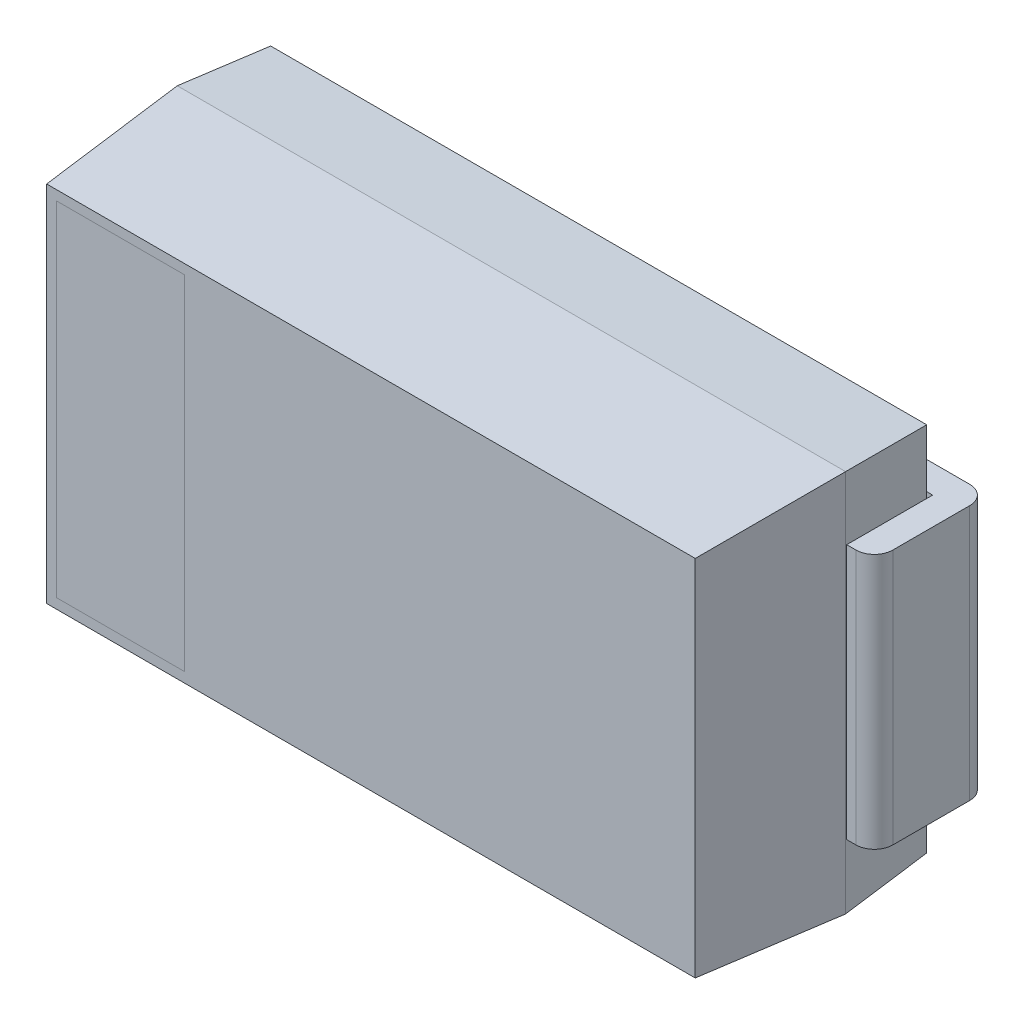
ISO-10303-21;
HEADER;
FILE_DESCRIPTION(('STEP AP214'),'2;1');
FILE_NAME('part.step','',(''),(''),'','','');
FILE_SCHEMA(('AUTOMOTIVE_DESIGN { 1 0 10303 214 1 1 1 1 }'));
ENDSEC;
DATA;
#1=APPLICATION_CONTEXT('core data for automotive mechanical design processes');
#2=APPLICATION_PROTOCOL_DEFINITION('international standard','automotive_design',2000,#1);
#3=PRODUCT_CONTEXT('',#1,'mechanical');
#4=PRODUCT('Part','Part','',(#3));
#5=PRODUCT_RELATED_PRODUCT_CATEGORY('part','',(#4));
#6=PRODUCT_DEFINITION_FORMATION('','',#4);
#7=PRODUCT_DEFINITION_CONTEXT('part definition',#1,'design');
#8=PRODUCT_DEFINITION('design','',#6,#7);
#9=PRODUCT_DEFINITION_SHAPE('','',#8);
#10=(LENGTH_UNIT() NAMED_UNIT(*) SI_UNIT(.MILLI.,.METRE.));
#11=(NAMED_UNIT(*) PLANE_ANGLE_UNIT() SI_UNIT($,.RADIAN.));
#12=(NAMED_UNIT(*) SI_UNIT($,.STERADIAN.) SOLID_ANGLE_UNIT());
#13=UNCERTAINTY_MEASURE_WITH_UNIT(LENGTH_MEASURE(1.E-05),#10,'distance_accuracy_value','');
#14=(GEOMETRIC_REPRESENTATION_CONTEXT(3) GLOBAL_UNCERTAINTY_ASSIGNED_CONTEXT((#13)) GLOBAL_UNIT_ASSIGNED_CONTEXT((#10,
#11,#12)) REPRESENTATION_CONTEXT('',''));
#15=CARTESIAN_POINT('',(0.,0.,0.));
#16=DIRECTION('',(0.,0.,1.));
#17=DIRECTION('',(1.,0.,0.));
#18=AXIS2_PLACEMENT_3D('',#15,#16,#17);
#19=CARTESIAN_POINT('',(1.57070097561994,-0.91,0.549975401404468));
#20=DIRECTION('',(0.997540140446752,0.,-0.0700975619937967));
#21=DIRECTION('',(-0.0700975619937967,0.,-0.997540140446752));
#22=AXIS2_PLACEMENT_3D('',#19,#20,#21);
#23=PLANE('',#22);
#24=CARTESIAN_POINT('',(1.541189128886,0.871189128886001,0.13));
#25=DIRECTION('',(0.0699259759924694,0.0699259759924605,0.995098344769502));
#26=VECTOR('',#25,1.);
#27=LINE('',#24,#26);
#28=CARTESIAN_POINT('',(1.541189128886,0.871189128886,0.13));
#29=VERTEX_POINT('',#28);
#30=CARTESIAN_POINT('',(1.57,0.9,0.54));
#31=VERTEX_POINT('',#30);
#32=EDGE_CURVE('E299',#29,#31,#27,.T.);
#33=ORIENTED_EDGE('',*,*,#32,.T.);
#34=DIRECTION('',(0.,1.,0.));
#35=VECTOR('',#34,1.);
#36=CARTESIAN_POINT('',(1.57,0.,0.54));
#37=LINE('',#36,#35);
#38=CARTESIAN_POINT('',(1.57,-0.9,0.54));
#39=VERTEX_POINT('',#38);
#40=EDGE_CURVE('E327',#39,#31,#37,.T.);
#41=ORIENTED_EDGE('',*,*,#40,.F.);
#42=CARTESIAN_POINT('',(1.57,-0.9,0.54));
#43=DIRECTION('',(-0.0699259759924694,0.0699259759924607,-0.995098344769502));
#44=VECTOR('',#43,1.);
#45=LINE('',#42,#44);
#46=CARTESIAN_POINT('',(1.541189128886,-0.871189128886,0.13));
#47=VERTEX_POINT('',#46);
#48=EDGE_CURVE('E310',#39,#47,#45,.T.);
#49=ORIENTED_EDGE('',*,*,#48,.T.);
#50=DIRECTION('',(0.,1.,0.));
#51=VECTOR('',#50,1.);
#52=CARTESIAN_POINT('',(1.541189128886,0.,0.13));
#53=LINE('',#52,#51);
#54=CARTESIAN_POINT('',(1.54123480465739,-0.6,0.130650000000008));
#55=VERTEX_POINT('',#54);
#56=EDGE_CURVE('E305',#47,#55,#53,.T.);
#57=ORIENTED_EDGE('',*,*,#56,.T.);
#58=DIRECTION('',(0.,1.,0.));
#59=VECTOR('',#58,1.);
#60=CARTESIAN_POINT('',(1.54128048042856,0.,0.131300000000031));
#61=LINE('',#60,#59);
#62=CARTESIAN_POINT('',(1.54123480465739,0.6,0.130650000000008));
#63=VERTEX_POINT('',#62);
#64=EDGE_CURVE('E300',#55,#63,#61,.T.);
#65=ORIENTED_EDGE('',*,*,#64,.T.);
#66=DIRECTION('',(0.,1.,0.));
#67=VECTOR('',#66,1.);
#68=CARTESIAN_POINT('',(1.541189128886,0.,0.13));
#69=LINE('',#68,#67);
#70=EDGE_CURVE('E296',#63,#29,#69,.T.);
#71=ORIENTED_EDGE('',*,*,#70,.T.);
#72=EDGE_LOOP('',(#33,#41,#49,#57,#65,#71));
#73=FACE_BOUND('',#72,.T.);
#74=ADVANCED_FACE('F17',(#73),#23,.T.);
#75=CARTESIAN_POINT('',(-1.54048815326606,-0.91,0.120024598595532));
#76=DIRECTION('',(-0.997540140446752,0.,-0.0700975619937967));
#77=DIRECTION('',(-0.0700975619937967,0.,0.997540140446752));
#78=AXIS2_PLACEMENT_3D('',#75,#76,#77);
#79=PLANE('',#78);
#80=CARTESIAN_POINT('',(-1.541189128886,-0.871189128886,0.13));
#81=DIRECTION('',(-0.0699259759924694,-0.0699259759924607,0.995098344769502));
#82=VECTOR('',#81,1.);
#83=LINE('',#80,#82);
#84=CARTESIAN_POINT('',(-1.541189128886,-0.871189128886,0.13));
#85=VERTEX_POINT('',#84);
#86=CARTESIAN_POINT('',(-1.57,-0.9,0.54));
#87=VERTEX_POINT('',#86);
#88=EDGE_CURVE('E282',#85,#87,#83,.T.);
#89=ORIENTED_EDGE('',*,*,#88,.T.);
#90=DIRECTION('',(0.,-1.,0.));
#91=VECTOR('',#90,1.);
#92=CARTESIAN_POINT('',(-1.57,0.,0.54));
#93=LINE('',#92,#91);
#94=CARTESIAN_POINT('',(-1.57,0.9,0.54));
#95=VERTEX_POINT('',#94);
#96=EDGE_CURVE('E313',#95,#87,#93,.T.);
#97=ORIENTED_EDGE('',*,*,#96,.F.);
#98=CARTESIAN_POINT('',(-1.57,0.900000000000001,0.54));
#99=DIRECTION('',(0.0699259759924694,-0.0699259759924605,-0.995098344769502));
#100=VECTOR('',#99,1.);
#101=LINE('',#98,#100);
#102=CARTESIAN_POINT('',(-1.541189128886,0.871189128885999,0.13));
#103=VERTEX_POINT('',#102);
#104=EDGE_CURVE('E293',#95,#103,#101,.T.);
#105=ORIENTED_EDGE('',*,*,#104,.T.);
#106=DIRECTION('',(0.,-1.,0.));
#107=VECTOR('',#106,1.);
#108=CARTESIAN_POINT('',(-1.541189128886,0.,0.13));
#109=LINE('',#108,#107);
#110=CARTESIAN_POINT('',(-1.54123480465739,0.6,0.130650000000008));
#111=VERTEX_POINT('',#110);
#112=EDGE_CURVE('E288',#103,#111,#109,.T.);
#113=ORIENTED_EDGE('',*,*,#112,.T.);
#114=DIRECTION('',(0.,-1.,0.));
#115=VECTOR('',#114,1.);
#116=CARTESIAN_POINT('',(-1.54128048042856,0.,0.131300000000031));
#117=LINE('',#116,#115);
#118=CARTESIAN_POINT('',(-1.54123480465739,-0.6,0.130650000000008));
#119=VERTEX_POINT('',#118);
#120=EDGE_CURVE('E283',#111,#119,#117,.T.);
#121=ORIENTED_EDGE('',*,*,#120,.T.);
#122=DIRECTION('',(0.,-1.,0.));
#123=VECTOR('',#122,1.);
#124=CARTESIAN_POINT('',(-1.541189128886,0.,0.13));
#125=LINE('',#124,#123);
#126=EDGE_CURVE('E279',#119,#85,#125,.T.);
#127=ORIENTED_EDGE('',*,*,#126,.T.);
#128=EDGE_LOOP('',(#89,#97,#105,#113,#121,#127));
#129=FACE_BOUND('',#128,.T.);
#130=ADVANCED_FACE('F353',(#129),#79,.T.);
#131=CARTESIAN_POINT('',(1.52292054892806,-0.91,1.20997540140447));
#132=DIRECTION('',(0.997540140446732,0.,0.0700975619940784));
#133=DIRECTION('',(0.0700975619940784,0.,-0.997540140446732));
#134=AXIS2_PLACEMENT_3D('',#131,#132,#133);
#135=PLANE('',#134);
#136=CARTESIAN_POINT('',(1.523621524548,-0.853621524548,1.2));
#137=DIRECTION('',(0.,1.,0.));
#138=VECTOR('',#137,1.);
#139=LINE('',#136,#138);
#140=CARTESIAN_POINT('',(1.523621524548,-0.853621524423,1.2));
#141=VERTEX_POINT('',#140);
#142=CARTESIAN_POINT('',(1.523621524548,0.853621524423,1.2));
#143=VERTEX_POINT('',#142);
#144=EDGE_CURVE('E559',#141,#143,#139,.T.);
#145=ORIENTED_EDGE('',*,*,#144,.F.);
#146=CARTESIAN_POINT('',(1.523621524548,-0.853621524548,1.2));
#147=DIRECTION('',(0.0699259759927496,-0.0699259759927517,-0.995098344769462));
#148=VECTOR('',#147,1.);
#149=LINE('',#146,#148);
#150=EDGE_CURVE('E317',#141,#39,#149,.T.);
#151=ORIENTED_EDGE('',*,*,#150,.T.);
#152=ORIENTED_EDGE('',*,*,#40,.T.);
#153=CARTESIAN_POINT('',(1.57,0.900000000000001,0.54));
#154=DIRECTION('',(-0.0699259759927496,-0.0699259759927513,0.995098344769462));
#155=VECTOR('',#154,1.);
#156=LINE('',#153,#155);
#157=EDGE_CURVE('E330',#31,#143,#156,.T.);
#158=ORIENTED_EDGE('',*,*,#157,.T.);
#159=EDGE_LOOP('',(#145,#151,#152,#158));
#160=FACE_BOUND('',#159,.T.);
#161=ADVANCED_FACE('F395',(#160),#135,.T.);
#162=CARTESIAN_POINT('',(-1.57070097561994,-0.91,0.530024598595533));
#163=DIRECTION('',(-0.997540140446732,0.,0.0700975619940784));
#164=DIRECTION('',(0.0700975619940784,0.,0.997540140446732));
#165=AXIS2_PLACEMENT_3D('',#162,#163,#164);
#166=PLANE('',#165);
#167=CARTESIAN_POINT('',(-1.523621524548,0.853621524548,1.2));
#168=DIRECTION('',(0.,-1.,0.));
#169=VECTOR('',#168,1.);
#170=LINE('',#167,#169);
#171=CARTESIAN_POINT('',(-1.523621524423,0.853621524548,1.2));
#172=VERTEX_POINT('',#171);
#173=CARTESIAN_POINT('',(-1.523621524548,-0.853621524423,1.2));
#174=VERTEX_POINT('',#173);
#175=EDGE_CURVE('E538',#172,#174,#170,.T.);
#176=ORIENTED_EDGE('',*,*,#175,.F.);
#177=CARTESIAN_POINT('',(-1.523621524548,0.853621524548001,1.2));
#178=DIRECTION('',(-0.0699259759927496,0.0699259759927522,-0.995098344769462));
#179=VECTOR('',#178,1.);
#180=LINE('',#177,#179);
#181=EDGE_CURVE('E428',#172,#95,#180,.T.);
#182=ORIENTED_EDGE('',*,*,#181,.T.);
#183=ORIENTED_EDGE('',*,*,#96,.T.);
#184=CARTESIAN_POINT('',(-1.57,-0.9,0.54));
#185=DIRECTION('',(0.0699259759927496,0.0699259759927517,0.995098344769462));
#186=VECTOR('',#185,1.);
#187=LINE('',#184,#186);
#188=EDGE_CURVE('E316',#87,#174,#187,.T.);
#189=ORIENTED_EDGE('',*,*,#188,.T.);
#190=EDGE_LOOP('',(#176,#182,#183,#189));
#191=FACE_BOUND('',#190,.T.);
#192=ADVANCED_FACE('F404',(#191),#166,.T.);
#193=CARTESIAN_POINT('',(-2.00571729278333,0.611910197020255,1.1987));
#194=DIRECTION('',(0.,0.,1.));
#195=DIRECTION('',(0.34835679774814,-0.93736201195838,0.));
#196=AXIS2_PLACEMENT_3D('',#193,#194,#195);
#197=PLANE('',#196);
#198=CARTESIAN_POINT('',(-1.477243049096,-0.807243049096,1.2));
#199=DIRECTION('',(0.,1.,0.));
#200=VECTOR('',#199,1.);
#201=LINE('',#198,#200);
#202=CARTESIAN_POINT('',(-1.477243049096,-0.807243049096,1.19935));
#203=VERTEX_POINT('',#202);
#204=CARTESIAN_POINT('',(-1.477243049096,0.807243049096,1.19935));
#205=VERTEX_POINT('',#204);
#206=EDGE_CURVE('E450',#203,#205,#201,.T.);
#207=ORIENTED_EDGE('',*,*,#206,.F.);
#208=CARTESIAN_POINT('',(-0.877243049096,-0.807243049096001,1.2));
#209=DIRECTION('',(-1.,0.,0.));
#210=VECTOR('',#209,1.);
#211=LINE('',#208,#210);
#212=CARTESIAN_POINT('',(-0.877243049221,-0.807243049096,1.19935));
#213=VERTEX_POINT('',#212);
#214=EDGE_CURVE('E516',#213,#203,#211,.T.);
#215=ORIENTED_EDGE('',*,*,#214,.F.);
#216=CARTESIAN_POINT('',(-0.877243049096,0.807243049096,1.2));
#217=DIRECTION('',(0.,-1.,0.));
#218=VECTOR('',#217,1.);
#219=LINE('',#216,#218);
#220=CARTESIAN_POINT('',(-0.877243049221,0.807243049096,1.19935));
#221=VERTEX_POINT('',#220);
#222=EDGE_CURVE('E506',#221,#213,#219,.T.);
#223=ORIENTED_EDGE('',*,*,#222,.F.);
#224=CARTESIAN_POINT('',(-1.477243049096,0.807243049096001,1.2));
#225=DIRECTION('',(1.,0.,0.));
#226=VECTOR('',#225,1.);
#227=LINE('',#224,#226);
#228=EDGE_CURVE('E485',#205,#221,#227,.T.);
#229=ORIENTED_EDGE('',*,*,#228,.F.);
#230=EDGE_LOOP('',(#207,#215,#223,#229));
#231=FACE_BOUND('',#230,.T.);
#232=ADVANCED_FACE('F456',(#231),#197,.T.);
#233=CARTESIAN_POINT('',(-2.25297173822662,-0.446143302434544,1.2));
#234=DIRECTION('',(0.,0.,1.));
#235=DIRECTION('',(0.872409952732968,-0.48877487084798,0.));
#236=AXIS2_PLACEMENT_3D('',#233,#234,#235);
#237=PLANE('',#236);
#238=ORIENTED_EDGE('',*,*,#228,.T.);
#239=ORIENTED_EDGE('',*,*,#222,.T.);
#240=ORIENTED_EDGE('',*,*,#214,.T.);
#241=ORIENTED_EDGE('',*,*,#206,.T.);
#242=EDGE_LOOP('',(#238,#239,#240,#241));
#243=FACE_BOUND('',#242,.T.);
#244=ORIENTED_EDGE('',*,*,#175,.T.);
#245=DIRECTION('',(-1.,0.,0.));
#246=VECTOR('',#245,1.);
#247=CARTESIAN_POINT('',(0.,-0.853621524548,1.2));
#248=LINE('',#247,#246);
#249=EDGE_CURVE('E272',#141,#174,#248,.T.);
#250=ORIENTED_EDGE('',*,*,#249,.F.);
#251=ORIENTED_EDGE('',*,*,#144,.T.);
#252=DIRECTION('',(1.,0.,0.));
#253=VECTOR('',#252,1.);
#254=CARTESIAN_POINT('',(0.,0.853621524548,1.2));
#255=LINE('',#254,#253);
#256=EDGE_CURVE('E225',#172,#143,#255,.T.);
#257=ORIENTED_EDGE('',*,*,#256,.F.);
#258=EDGE_LOOP('',(#244,#250,#251,#257));
#259=FACE_BOUND('',#258,.T.);
#260=ADVANCED_FACE('F465',(#243,#259),#237,.T.);
#261=CARTESIAN_POINT('',(-1.58,-0.852920548928059,1.20997540140447));
#262=DIRECTION('',(0.,-0.997540140446732,0.0700975619940813));
#263=DIRECTION('',(0.,-0.0700975619940813,-0.997540140446732));
#264=AXIS2_PLACEMENT_3D('',#261,#262,#263);
#265=PLANE('',#264);
#266=ORIENTED_EDGE('',*,*,#249,.T.);
#267=ORIENTED_EDGE('',*,*,#188,.F.);
#268=DIRECTION('',(-1.,0.,0.));
#269=VECTOR('',#268,1.);
#270=CARTESIAN_POINT('',(0.,-0.9,0.54));
#271=LINE('',#270,#269);
#272=EDGE_CURVE('E240',#39,#87,#271,.T.);
#273=ORIENTED_EDGE('',*,*,#272,.F.);
#274=ORIENTED_EDGE('',*,*,#150,.F.);
#275=EDGE_LOOP('',(#266,#267,#273,#274));
#276=FACE_BOUND('',#275,.T.);
#277=ADVANCED_FACE('F583',(#276),#265,.T.);
#278=CARTESIAN_POINT('',(-1.613333333333,0.6,0.08666666666667));
#279=DIRECTION('',(0.,-1.,0.));
#280=DIRECTION('',(0.,0.,-1.));
#281=AXIS2_PLACEMENT_3D('',#278,#279,#280);
#282=CYLINDRICAL_SURFACE('',#281,0.0866666666666697);
#283=DIRECTION('',(0.,1.,0.));
#284=VECTOR('',#283,1.);
#285=CARTESIAN_POINT('',(-1.613333333333,0.,0.));
#286=LINE('',#285,#284);
#287=CARTESIAN_POINT('',(-1.613333333333,-0.6,0.));
#288=VERTEX_POINT('',#287);
#289=CARTESIAN_POINT('',(-1.613333333333,0.6,0.));
#290=VERTEX_POINT('',#289);
#291=EDGE_CURVE('E215',#288,#290,#286,.T.);
#292=ORIENTED_EDGE('',*,*,#291,.F.);
#293=CARTESIAN_POINT('',(-1.613333333333,-0.6,0.08666666666667));
#294=DIRECTION('',(0.,-1.,0.));
#295=DIRECTION('',(0.,0.,-1.));
#296=AXIS2_PLACEMENT_3D('',#293,#294,#295);
#297=CIRCLE('',#296,0.0866666666666697);
#298=CARTESIAN_POINT('',(-1.7,-0.6,0.0866666666666701));
#299=VERTEX_POINT('',#298);
#300=EDGE_CURVE('E21',#299,#288,#297,.T.);
#301=ORIENTED_EDGE('',*,*,#300,.F.);
#302=DIRECTION('',(0.,-1.,0.));
#303=VECTOR('',#302,1.);
#304=CARTESIAN_POINT('',(-1.7,0.,0.0866666666666701));
#305=LINE('',#304,#303);
#306=CARTESIAN_POINT('',(-1.7,0.6,0.0866666666666701));
#307=VERTEX_POINT('',#306);
#308=EDGE_CURVE('E210',#307,#299,#305,.T.);
#309=ORIENTED_EDGE('',*,*,#308,.F.);
#310=CARTESIAN_POINT('',(-1.613333333333,0.6,0.08666666666667));
#311=DIRECTION('',(0.,-1.,0.));
#312=DIRECTION('',(0.,0.,-1.));
#313=AXIS2_PLACEMENT_3D('',#310,#311,#312);
#314=CIRCLE('',#313,0.0866666666666697);
#315=EDGE_CURVE('E221',#290,#307,#314,.F.);
#316=ORIENTED_EDGE('',*,*,#315,.F.);
#317=EDGE_LOOP('',(#292,#301,#309,#316));
#318=FACE_BOUND('',#317,.T.);
#319=ADVANCED_FACE('F217',(#318),#282,.T.);
#320=CARTESIAN_POINT('',(-1.7,-0.601,0.448933333333));
#321=DIRECTION('',(-1.,0.,0.));
#322=DIRECTION('',(0.,1.,0.));
#323=AXIS2_PLACEMENT_3D('',#320,#321,#322);
#324=PLANE('',#323);
#325=DIRECTION('',(0.,0.,1.));
#326=VECTOR('',#325,1.);
#327=CARTESIAN_POINT('',(-1.7,0.6,0.2673));
#328=LINE('',#327,#326);
#329=CARTESIAN_POINT('',(-1.69999999999984,0.6,0.447933333333));
#330=VERTEX_POINT('',#329);
#331=EDGE_CURVE('E760',#307,#330,#328,.T.);
#332=ORIENTED_EDGE('',*,*,#331,.F.);
#333=ORIENTED_EDGE('',*,*,#308,.T.);
#334=DIRECTION('',(0.,0.,-1.));
#335=VECTOR('',#334,1.);
#336=CARTESIAN_POINT('',(-1.7,-0.6,0.2673));
#337=LINE('',#336,#335);
#338=CARTESIAN_POINT('',(-1.69999999999984,-0.6,0.447933333333));
#339=VERTEX_POINT('',#338);
#340=EDGE_CURVE('E239',#339,#299,#337,.T.);
#341=ORIENTED_EDGE('',*,*,#340,.F.);
#342=DIRECTION('',(0.,-1.,0.));
#343=VECTOR('',#342,1.);
#344=CARTESIAN_POINT('',(-1.69999999999967,0.,0.447933333333));
#345=LINE('',#344,#343);
#346=EDGE_CURVE('E268',#330,#339,#345,.T.);
#347=ORIENTED_EDGE('',*,*,#346,.F.);
#348=EDGE_LOOP('',(#332,#333,#341,#347));
#349=FACE_BOUND('',#348,.T.);
#350=ADVANCED_FACE('F1167',(#349),#324,.T.);
#351=CARTESIAN_POINT('',(-1.613333333333,0.6,0.447933333333));
#352=DIRECTION('',(0.,-1.,0.));
#353=DIRECTION('',(0.,0.,-1.));
#354=AXIS2_PLACEMENT_3D('',#351,#352,#353);
#355=CYLINDRICAL_SURFACE('',#354,0.0866666666666698);
#356=CARTESIAN_POINT('',(-1.613333333333,0.6,0.447933333333));
#357=DIRECTION('',(0.,-1.,0.));
#358=DIRECTION('',(0.,0.,-1.));
#359=AXIS2_PLACEMENT_3D('',#356,#357,#358);
#360=CIRCLE('',#359,0.0866666666666698);
#361=CARTESIAN_POINT('',(-1.613333333333,0.6,0.5346));
#362=VERTEX_POINT('',#361);
#363=EDGE_CURVE('E757',#330,#362,#360,.F.);
#364=ORIENTED_EDGE('',*,*,#363,.F.);
#365=ORIENTED_EDGE('',*,*,#346,.T.);
#366=CARTESIAN_POINT('',(-1.613333333333,-0.6,0.447933333333));
#367=DIRECTION('',(0.,-1.,0.));
#368=DIRECTION('',(0.,0.,-1.));
#369=AXIS2_PLACEMENT_3D('',#366,#367,#368);
#370=CIRCLE('',#369,0.0866666666666698);
#371=CARTESIAN_POINT('',(-1.613333333333,-0.6,0.5346));
#372=VERTEX_POINT('',#371);
#373=EDGE_CURVE('E249',#372,#339,#370,.T.);
#374=ORIENTED_EDGE('',*,*,#373,.F.);
#375=DIRECTION('',(0.,-1.,0.));
#376=VECTOR('',#375,1.);
#377=CARTESIAN_POINT('',(-1.613333333333,0.,0.5346));
#378=LINE('',#377,#376);
#379=EDGE_CURVE('E264',#362,#372,#378,.T.);
#380=ORIENTED_EDGE('',*,*,#379,.F.);
#381=EDGE_LOOP('',(#364,#365,#374,#380));
#382=FACE_BOUND('',#381,.T.);
#383=ADVANCED_FACE('F1158',(#382),#355,.T.);
#384=CARTESIAN_POINT('',(-1.569,-0.601,0.5346));
#385=DIRECTION('',(0.,0.,1.));
#386=DIRECTION('',(0.,1.,0.));
#387=AXIS2_PLACEMENT_3D('',#384,#385,#386);
#388=PLANE('',#387);
#389=DIRECTION('',(1.,0.,0.));
#390=VECTOR('',#389,1.);
#391=CARTESIAN_POINT('',(-1.235,0.6,0.5346));
#392=LINE('',#391,#390);
#393=CARTESIAN_POINT('',(-1.57,0.6,0.5346));
#394=VERTEX_POINT('',#393);
#395=EDGE_CURVE('E260',#362,#394,#392,.T.);
#396=ORIENTED_EDGE('',*,*,#395,.F.);
#397=ORIENTED_EDGE('',*,*,#379,.T.);
#398=DIRECTION('',(-1.,0.,0.));
#399=VECTOR('',#398,1.);
#400=CARTESIAN_POINT('',(-1.235,-0.6,0.5346));
#401=LINE('',#400,#399);
#402=CARTESIAN_POINT('',(-1.57,-0.6,0.5346));
#403=VERTEX_POINT('',#402);
#404=EDGE_CURVE('E276',#403,#372,#401,.T.);
#405=ORIENTED_EDGE('',*,*,#404,.F.);
#406=DIRECTION('',(0.,-1.,0.));
#407=VECTOR('',#406,1.);
#408=CARTESIAN_POINT('',(-1.57,0.,0.5346));
#409=LINE('',#408,#407);
#410=EDGE_CURVE('E253',#394,#403,#409,.T.);
#411=ORIENTED_EDGE('',*,*,#410,.F.);
#412=EDGE_LOOP('',(#396,#397,#405,#411));
#413=FACE_BOUND('',#412,.T.);
#414=ADVANCED_FACE('F1149',(#413),#388,.T.);
#415=CARTESIAN_POINT('',(-1.57,0.601,0.5356));
#416=DIRECTION('',(1.,0.,0.));
#417=DIRECTION('',(0.,-1.,0.));
#418=AXIS2_PLACEMENT_3D('',#415,#416,#417);
#419=PLANE('',#418);
#420=ORIENTED_EDGE('',*,*,#410,.T.);
#421=DIRECTION('',(0.,0.,1.));
#422=VECTOR('',#421,1.);
#423=CARTESIAN_POINT('',(-1.57,-0.6,0.2673));
#424=LINE('',#423,#422);
#425=CARTESIAN_POINT('',(-1.57,-0.6,0.1313));
#426=VERTEX_POINT('',#425);
#427=EDGE_CURVE('E273',#426,#403,#424,.T.);
#428=ORIENTED_EDGE('',*,*,#427,.F.);
#429=DIRECTION('',(0.,-1.,0.));
#430=VECTOR('',#429,1.);
#431=CARTESIAN_POINT('',(-1.57,0.,0.1313));
#432=LINE('',#431,#430);
#433=CARTESIAN_POINT('',(-1.57,0.6,0.1313));
#434=VERTEX_POINT('',#433);
#435=EDGE_CURVE('E226',#434,#426,#432,.T.);
#436=ORIENTED_EDGE('',*,*,#435,.F.);
#437=DIRECTION('',(0.,0.,-1.));
#438=VECTOR('',#437,1.);
#439=CARTESIAN_POINT('',(-1.57,0.6,0.2673));
#440=LINE('',#439,#438);
#441=EDGE_CURVE('E256',#394,#434,#440,.T.);
#442=ORIENTED_EDGE('',*,*,#441,.F.);
#443=EDGE_LOOP('',(#420,#428,#436,#442));
#444=FACE_BOUND('',#443,.T.);
#445=ADVANCED_FACE('F1142',(#444),#419,.T.);
#446=CARTESIAN_POINT('',(-1.540280480429,-0.601,0.1313));
#447=DIRECTION('',(0.,0.,1.));
#448=DIRECTION('',(0.,1.,0.));
#449=AXIS2_PLACEMENT_3D('',#446,#447,#448);
#450=PLANE('',#449);
#451=ORIENTED_EDGE('',*,*,#435,.T.);
#452=DIRECTION('',(-1.,0.,0.));
#453=VECTOR('',#452,1.);
#454=CARTESIAN_POINT('',(-1.235,-0.6,0.1313));
#455=LINE('',#454,#453);
#456=EDGE_CURVE('E234',#119,#426,#455,.T.);
#457=ORIENTED_EDGE('',*,*,#456,.F.);
#458=ORIENTED_EDGE('',*,*,#120,.F.);
#459=DIRECTION('',(1.,0.,0.));
#460=VECTOR('',#459,1.);
#461=CARTESIAN_POINT('',(-1.235,0.6,0.1313));
#462=LINE('',#461,#460);
#463=EDGE_CURVE('E259',#434,#111,#462,.T.);
#464=ORIENTED_EDGE('',*,*,#463,.F.);
#465=EDGE_LOOP('',(#451,#457,#458,#464));
#466=FACE_BOUND('',#465,.T.);
#467=ADVANCED_FACE('F777',(#466),#450,.T.);
#468=CARTESIAN_POINT('',(-1.614333333333,0.601,0.));
#469=DIRECTION('',(0.,0.,-1.));
#470=DIRECTION('',(1.,0.,0.));
#471=AXIS2_PLACEMENT_3D('',#468,#469,#470);
#472=PLANE('',#471);
#473=DIRECTION('',(-1.,0.,0.));
#474=VECTOR('',#473,1.);
#475=CARTESIAN_POINT('',(-1.235,0.6,0.));
#476=LINE('',#475,#474);
#477=CARTESIAN_POINT('',(-0.77,0.6,0.));
#478=VERTEX_POINT('',#477);
#479=EDGE_CURVE('E324',#478,#290,#476,.T.);
#480=ORIENTED_EDGE('',*,*,#479,.F.);
#481=DIRECTION('',(0.,1.,0.));
#482=VECTOR('',#481,1.);
#483=CARTESIAN_POINT('',(-0.77,0.,0.));
#484=LINE('',#483,#482);
#485=CARTESIAN_POINT('',(-0.77,-0.6,0.));
#486=VERTEX_POINT('',#485);
#487=EDGE_CURVE('E231',#486,#478,#484,.T.);
#488=ORIENTED_EDGE('',*,*,#487,.F.);
#489=DIRECTION('',(1.,0.,0.));
#490=VECTOR('',#489,1.);
#491=CARTESIAN_POINT('',(-1.235,-0.6,0.));
#492=LINE('',#491,#490);
#493=EDGE_CURVE('E229',#288,#486,#492,.T.);
#494=ORIENTED_EDGE('',*,*,#493,.F.);
#495=ORIENTED_EDGE('',*,*,#291,.T.);
#496=EDGE_LOOP('',(#480,#488,#494,#495));
#497=FACE_BOUND('',#496,.T.);
#498=ADVANCED_FACE('F230',(#497),#472,.T.);
#499=CARTESIAN_POINT('',(-1.58,0.900700975619941,0.530024598595533));
#500=DIRECTION('',(0.,0.997540140446732,0.0700975619940813));
#501=DIRECTION('',(0.,-0.0700975619940813,0.997540140446732));
#502=AXIS2_PLACEMENT_3D('',#499,#500,#501);
#503=PLANE('',#502);
#504=ORIENTED_EDGE('',*,*,#256,.T.);
#505=ORIENTED_EDGE('',*,*,#157,.F.);
#506=DIRECTION('',(1.,0.,0.));
#507=VECTOR('',#506,1.);
#508=CARTESIAN_POINT('',(0.,0.9,0.54));
#509=LINE('',#508,#507);
#510=EDGE_CURVE('E320',#95,#31,#509,.T.);
#511=ORIENTED_EDGE('',*,*,#510,.F.);
#512=ORIENTED_EDGE('',*,*,#181,.F.);
#513=EDGE_LOOP('',(#504,#505,#511,#512));
#514=FACE_BOUND('',#513,.T.);
#515=ADVANCED_FACE('F610',(#514),#503,.T.);
#516=CARTESIAN_POINT('',(-0.0911519268025877,-1.19382312163027,0.));
#517=DIRECTION('',(0.,0.,-1.));
#518=DIRECTION('',(-0.645942241466129,0.763386285369153,0.));
#519=AXIS2_PLACEMENT_3D('',#516,#517,#518);
#520=PLANE('',#519);
#521=DIRECTION('',(0.,-1.,0.));
#522=VECTOR('',#521,1.);
#523=CARTESIAN_POINT('',(-0.55,0.,0.));
#524=LINE('',#523,#522);
#525=CARTESIAN_POINT('',(-0.55,0.64999999975,0.));
#526=VERTEX_POINT('',#525);
#527=CARTESIAN_POINT('',(-0.54999999975,-0.65,0.));
#528=VERTEX_POINT('',#527);
#529=EDGE_CURVE('E694',#526,#528,#524,.T.);
#530=ORIENTED_EDGE('',*,*,#529,.F.);
#531=DIRECTION('',(-1.,0.,0.));
#532=VECTOR('',#531,1.);
#533=CARTESIAN_POINT('',(0.,0.65,0.));
#534=LINE('',#533,#532);
#535=CARTESIAN_POINT('',(0.55,0.64999999975,0.));
#536=VERTEX_POINT('',#535);
#537=EDGE_CURVE('E705',#536,#526,#534,.T.);
#538=ORIENTED_EDGE('',*,*,#537,.F.);
#539=DIRECTION('',(0.,1.,0.));
#540=VECTOR('',#539,1.);
#541=CARTESIAN_POINT('',(0.55,0.,0.));
#542=LINE('',#541,#540);
#543=CARTESIAN_POINT('',(0.55,-0.64999999975,0.));
#544=VERTEX_POINT('',#543);
#545=EDGE_CURVE('E323',#544,#536,#542,.T.);
#546=ORIENTED_EDGE('',*,*,#545,.F.);
#547=DIRECTION('',(1.,0.,0.));
#548=VECTOR('',#547,1.);
#549=CARTESIAN_POINT('',(0.,-0.65,0.));
#550=LINE('',#549,#548);
#551=EDGE_CURVE('E693',#528,#544,#550,.T.);
#552=ORIENTED_EDGE('',*,*,#551,.F.);
#553=EDGE_LOOP('',(#530,#538,#546,#552));
#554=FACE_BOUND('',#553,.T.);
#555=ADVANCED_FACE('F620',(#554),#520,.T.);
#556=CARTESIAN_POINT('',(-1.58,-0.900700975619938,0.549975401404468));
#557=DIRECTION('',(0.,-0.997540140446753,-0.0700975619937879));
#558=DIRECTION('',(0.,0.0700975619937879,-0.997540140446753));
#559=AXIS2_PLACEMENT_3D('',#556,#557,#558);
#560=PLANE('',#559);
#561=ORIENTED_EDGE('',*,*,#272,.T.);
#562=ORIENTED_EDGE('',*,*,#88,.F.);
#563=DIRECTION('',(-1.,0.,0.));
#564=VECTOR('',#563,1.);
#565=CARTESIAN_POINT('',(1.541189128886,-0.871189128885999,0.13));
#566=LINE('',#565,#564);
#567=EDGE_CURVE('E750',#47,#85,#566,.T.);
#568=ORIENTED_EDGE('',*,*,#567,.F.);
#569=ORIENTED_EDGE('',*,*,#48,.F.);
#570=EDGE_LOOP('',(#561,#562,#568,#569));
#571=FACE_BOUND('',#570,.T.);
#572=ADVANCED_FACE('F640',(#571),#560,.T.);
#573=CARTESIAN_POINT('',(-1.701,-0.6,0.5356));
#574=DIRECTION('',(0.,-1.,0.));
#575=DIRECTION('',(0.,0.,-1.));
#576=AXIS2_PLACEMENT_3D('',#573,#574,#575);
#577=PLANE('',#576);
#578=ORIENTED_EDGE('',*,*,#404,.T.);
#579=ORIENTED_EDGE('',*,*,#373,.T.);
#580=ORIENTED_EDGE('',*,*,#340,.T.);
#581=ORIENTED_EDGE('',*,*,#300,.T.);
#582=ORIENTED_EDGE('',*,*,#493,.T.);
#583=DIRECTION('',(0.,0.,-1.));
#584=VECTOR('',#583,1.);
#585=CARTESIAN_POINT('',(-0.77,-0.6,0.065));
#586=LINE('',#585,#584);
#587=CARTESIAN_POINT('',(-0.77,-0.6,0.13));
#588=VERTEX_POINT('',#587);
#589=EDGE_CURVE('E248',#588,#486,#586,.T.);
#590=ORIENTED_EDGE('',*,*,#589,.F.);
#591=DIRECTION('',(1.,0.,0.));
#592=VECTOR('',#591,1.);
#593=CARTESIAN_POINT('',(-1.541189128886,-0.599999999999999,0.13));
#594=LINE('',#593,#592);
#595=EDGE_CURVE('E747',#119,#588,#594,.T.);
#596=ORIENTED_EDGE('',*,*,#595,.F.);
#597=ORIENTED_EDGE('',*,*,#456,.T.);
#598=ORIENTED_EDGE('',*,*,#427,.T.);
#599=EDGE_LOOP('',(#578,#579,#580,#581,#582,#590,#596,#597,#598));
#600=FACE_BOUND('',#599,.T.);
#601=ADVANCED_FACE('F237',(#600),#577,.T.);
#602=CARTESIAN_POINT('',(-0.77,0.601,0.131));
#603=DIRECTION('',(1.,0.,0.));
#604=DIRECTION('',(0.,-1.,0.));
#605=AXIS2_PLACEMENT_3D('',#602,#603,#604);
#606=PLANE('',#605);
#607=DIRECTION('',(0.,1.,0.));
#608=VECTOR('',#607,1.);
#609=CARTESIAN_POINT('',(-0.77,-0.6,0.13));
#610=LINE('',#609,#608);
#611=CARTESIAN_POINT('',(-0.77,0.6,0.13));
#612=VERTEX_POINT('',#611);
#613=EDGE_CURVE('E742',#588,#612,#610,.T.);
#614=ORIENTED_EDGE('',*,*,#613,.F.);
#615=ORIENTED_EDGE('',*,*,#589,.T.);
#616=ORIENTED_EDGE('',*,*,#487,.T.);
#617=DIRECTION('',(0.,0.,-1.));
#618=VECTOR('',#617,1.);
#619=CARTESIAN_POINT('',(-0.77,0.6,0.2673));
#620=LINE('',#619,#618);
#621=EDGE_CURVE('E875',#612,#478,#620,.T.);
#622=ORIENTED_EDGE('',*,*,#621,.F.);
#623=EDGE_LOOP('',(#614,#615,#616,#622));
#624=FACE_BOUND('',#623,.T.);
#625=ADVANCED_FACE('F892',(#624),#606,.T.);
#626=CARTESIAN_POINT('',(-1.701,0.6,-0.000999999999999995));
#627=DIRECTION('',(0.,1.,0.));
#628=DIRECTION('',(0.,0.,1.));
#629=AXIS2_PLACEMENT_3D('',#626,#627,#628);
#630=PLANE('',#629);
#631=ORIENTED_EDGE('',*,*,#621,.T.);
#632=ORIENTED_EDGE('',*,*,#479,.T.);
#633=ORIENTED_EDGE('',*,*,#315,.T.);
#634=ORIENTED_EDGE('',*,*,#331,.T.);
#635=ORIENTED_EDGE('',*,*,#363,.T.);
#636=ORIENTED_EDGE('',*,*,#395,.T.);
#637=ORIENTED_EDGE('',*,*,#441,.T.);
#638=ORIENTED_EDGE('',*,*,#463,.T.);
#639=DIRECTION('',(-1.,0.,0.));
#640=VECTOR('',#639,1.);
#641=CARTESIAN_POINT('',(-0.77,0.600000000000001,0.13));
#642=LINE('',#641,#640);
#643=EDGE_CURVE('E737',#612,#111,#642,.T.);
#644=ORIENTED_EDGE('',*,*,#643,.F.);
#645=EDGE_LOOP('',(#631,#632,#633,#634,#635,#636,#637,#638,#644));
#646=FACE_BOUND('',#645,.T.);
#647=ADVANCED_FACE('F679',(#646),#630,.T.);
#648=CARTESIAN_POINT('',(-1.58,0.870488153266062,0.120024598595532));
#649=DIRECTION('',(0.,0.997540140446753,-0.0700975619937879));
#650=DIRECTION('',(0.,0.0700975619937879,0.997540140446753));
#651=AXIS2_PLACEMENT_3D('',#648,#649,#650);
#652=PLANE('',#651);
#653=ORIENTED_EDGE('',*,*,#510,.T.);
#654=ORIENTED_EDGE('',*,*,#32,.F.);
#655=DIRECTION('',(1.,0.,0.));
#656=VECTOR('',#655,1.);
#657=CARTESIAN_POINT('',(-1.541189128886,0.871189128885999,0.13));
#658=LINE('',#657,#656);
#659=EDGE_CURVE('E735',#103,#29,#658,.T.);
#660=ORIENTED_EDGE('',*,*,#659,.F.);
#661=ORIENTED_EDGE('',*,*,#104,.F.);
#662=EDGE_LOOP('',(#653,#654,#660,#661));
#663=FACE_BOUND('',#662,.T.);
#664=ADVANCED_FACE('F668',(#663),#652,.T.);
#665=CARTESIAN_POINT('',(0.55,-0.651,-0.000999999999999995));
#666=DIRECTION('',(1.,0.,0.));
#667=DIRECTION('',(0.,1.,0.));
#668=AXIS2_PLACEMENT_3D('',#665,#666,#667);
#669=PLANE('',#668);
#670=DIRECTION('',(0.,1.,0.));
#671=VECTOR('',#670,1.);
#672=CARTESIAN_POINT('',(0.55,-0.65,0.13));
#673=LINE('',#672,#671);
#674=CARTESIAN_POINT('',(0.55,-0.65,0.13));
#675=VERTEX_POINT('',#674);
#676=CARTESIAN_POINT('',(0.55,0.650000000000001,0.13));
#677=VERTEX_POINT('',#676);
#678=EDGE_CURVE('E732',#675,#677,#673,.T.);
#679=ORIENTED_EDGE('',*,*,#678,.F.);
#680=DIRECTION('',(0.,0.,1.));
#681=VECTOR('',#680,1.);
#682=CARTESIAN_POINT('',(0.55,-0.65,0.065));
#683=LINE('',#682,#681);
#684=EDGE_CURVE('E699',#544,#675,#683,.T.);
#685=ORIENTED_EDGE('',*,*,#684,.F.);
#686=ORIENTED_EDGE('',*,*,#545,.T.);
#687=DIRECTION('',(0.,0.,-1.));
#688=VECTOR('',#687,1.);
#689=CARTESIAN_POINT('',(0.55,0.65,0.065));
#690=LINE('',#689,#688);
#691=EDGE_CURVE('E702',#677,#536,#690,.T.);
#692=ORIENTED_EDGE('',*,*,#691,.F.);
#693=EDGE_LOOP('',(#679,#685,#686,#692));
#694=FACE_BOUND('',#693,.T.);
#695=ADVANCED_FACE('F678',(#694),#669,.T.);
#696=CARTESIAN_POINT('',(0.551,0.65,-0.000999999999999995));
#697=DIRECTION('',(0.,1.,0.));
#698=DIRECTION('',(-1.,0.,0.));
#699=AXIS2_PLACEMENT_3D('',#696,#697,#698);
#700=PLANE('',#699);
#701=DIRECTION('',(-1.,0.,0.));
#702=VECTOR('',#701,1.);
#703=CARTESIAN_POINT('',(0.55,0.650000000000001,0.13));
#704=LINE('',#703,#702);
#705=CARTESIAN_POINT('',(-0.55,0.65,0.13));
#706=VERTEX_POINT('',#705);
#707=EDGE_CURVE('E729',#677,#706,#704,.T.);
#708=ORIENTED_EDGE('',*,*,#707,.F.);
#709=ORIENTED_EDGE('',*,*,#691,.T.);
#710=ORIENTED_EDGE('',*,*,#537,.T.);
#711=DIRECTION('',(0.,0.,-1.));
#712=VECTOR('',#711,1.);
#713=CARTESIAN_POINT('',(-0.55,0.65,0.065));
#714=LINE('',#713,#712);
#715=EDGE_CURVE('E685',#706,#526,#714,.T.);
#716=ORIENTED_EDGE('',*,*,#715,.F.);
#717=EDGE_LOOP('',(#708,#709,#710,#716));
#718=FACE_BOUND('',#717,.T.);
#719=ADVANCED_FACE('F959',(#718),#700,.T.);
#720=CARTESIAN_POINT('',(-0.55,0.651,-0.000999999999999995));
#721=DIRECTION('',(-1.,0.,0.));
#722=DIRECTION('',(0.,-1.,0.));
#723=AXIS2_PLACEMENT_3D('',#720,#721,#722);
#724=PLANE('',#723);
#725=DIRECTION('',(0.,-1.,0.));
#726=VECTOR('',#725,1.);
#727=CARTESIAN_POINT('',(-0.55,0.650000000000001,0.13));
#728=LINE('',#727,#726);
#729=CARTESIAN_POINT('',(-0.55,-0.65,0.13));
#730=VERTEX_POINT('',#729);
#731=EDGE_CURVE('E726',#706,#730,#728,.T.);
#732=ORIENTED_EDGE('',*,*,#731,.F.);
#733=ORIENTED_EDGE('',*,*,#715,.T.);
#734=ORIENTED_EDGE('',*,*,#529,.T.);
#735=DIRECTION('',(0.,0.,-1.));
#736=VECTOR('',#735,1.);
#737=CARTESIAN_POINT('',(-0.55,-0.65,0.065));
#738=LINE('',#737,#736);
#739=EDGE_CURVE('E695',#730,#528,#738,.T.);
#740=ORIENTED_EDGE('',*,*,#739,.F.);
#741=EDGE_LOOP('',(#732,#733,#734,#740));
#742=FACE_BOUND('',#741,.T.);
#743=ADVANCED_FACE('F956',(#742),#724,.T.);
#744=CARTESIAN_POINT('',(-0.551,-0.65,-0.000999999999999995));
#745=DIRECTION('',(0.,-1.,0.));
#746=DIRECTION('',(1.,0.,0.));
#747=AXIS2_PLACEMENT_3D('',#744,#745,#746);
#748=PLANE('',#747);
#749=DIRECTION('',(1.,0.,0.));
#750=VECTOR('',#749,1.);
#751=CARTESIAN_POINT('',(-0.550000000000001,-0.65,0.13));
#752=LINE('',#751,#750);
#753=EDGE_CURVE('E722',#730,#675,#752,.T.);
#754=ORIENTED_EDGE('',*,*,#753,.F.);
#755=ORIENTED_EDGE('',*,*,#739,.T.);
#756=ORIENTED_EDGE('',*,*,#551,.T.);
#757=ORIENTED_EDGE('',*,*,#684,.T.);
#758=EDGE_LOOP('',(#754,#755,#756,#757));
#759=FACE_BOUND('',#758,.T.);
#760=ADVANCED_FACE('F953',(#759),#748,.T.);
#761=CARTESIAN_POINT('',(1.7,0.601,0.448933333333));
#762=DIRECTION('',(1.,0.,0.));
#763=DIRECTION('',(0.,-1.,0.));
#764=AXIS2_PLACEMENT_3D('',#761,#762,#763);
#765=PLANE('',#764);
#766=DIRECTION('',(0.,0.,1.));
#767=VECTOR('',#766,1.);
#768=CARTESIAN_POINT('',(1.7,-0.6,0.2673));
#769=LINE('',#768,#767);
#770=CARTESIAN_POINT('',(1.69999999999983,-0.6,0.08666666666667));
#771=VERTEX_POINT('',#770);
#772=CARTESIAN_POINT('',(1.69999999999983,-0.6,0.447933333333));
#773=VERTEX_POINT('',#772);
#774=EDGE_CURVE('E710',#771,#773,#769,.T.);
#775=ORIENTED_EDGE('',*,*,#774,.F.);
#776=DIRECTION('',(0.,-1.,0.));
#777=VECTOR('',#776,1.);
#778=CARTESIAN_POINT('',(1.69999999999967,0.,0.08666666666667));
#779=LINE('',#778,#777);
#780=CARTESIAN_POINT('',(1.69999999999983,0.6,0.08666666666667));
#781=VERTEX_POINT('',#780);
#782=EDGE_CURVE('E717',#781,#771,#779,.T.);
#783=ORIENTED_EDGE('',*,*,#782,.F.);
#784=DIRECTION('',(0.,0.,-1.));
#785=VECTOR('',#784,1.);
#786=CARTESIAN_POINT('',(1.7,0.6,0.2673));
#787=LINE('',#786,#785);
#788=CARTESIAN_POINT('',(1.69999999999983,0.6,0.447933333333));
#789=VERTEX_POINT('',#788);
#790=EDGE_CURVE('E725',#789,#781,#787,.T.);
#791=ORIENTED_EDGE('',*,*,#790,.F.);
#792=DIRECTION('',(0.,1.,0.));
#793=VECTOR('',#792,1.);
#794=CARTESIAN_POINT('',(1.69999999999967,0.,0.447933333333));
#795=LINE('',#794,#793);
#796=EDGE_CURVE('E698',#773,#789,#795,.T.);
#797=ORIENTED_EDGE('',*,*,#796,.F.);
#798=EDGE_LOOP('',(#775,#783,#791,#797));
#799=FACE_BOUND('',#798,.T.);
#800=ADVANCED_FACE('F914',(#799),#765,.T.);
#801=CARTESIAN_POINT('',(1.613333333333,-0.6,0.447933333333));
#802=DIRECTION('',(0.,1.,0.));
#803=DIRECTION('',(0.,0.,1.));
#804=AXIS2_PLACEMENT_3D('',#801,#802,#803);
#805=CYLINDRICAL_SURFACE('',#804,0.0866666666666698);
#806=CARTESIAN_POINT('',(1.613333333333,-0.6,0.447933333333));
#807=DIRECTION('',(0.,1.,0.));
#808=DIRECTION('',(0.,0.,1.));
#809=AXIS2_PLACEMENT_3D('',#806,#807,#808);
#810=CIRCLE('',#809,0.0866666666666698);
#811=CARTESIAN_POINT('',(1.613333333333,-0.6,0.5346));
#812=VERTEX_POINT('',#811);
#813=EDGE_CURVE('E706',#773,#812,#810,.F.);
#814=ORIENTED_EDGE('',*,*,#813,.F.);
#815=ORIENTED_EDGE('',*,*,#796,.T.);
#816=CARTESIAN_POINT('',(1.613333333333,0.6,0.447933333333));
#817=DIRECTION('',(0.,1.,0.));
#818=DIRECTION('',(0.,0.,1.));
#819=AXIS2_PLACEMENT_3D('',#816,#817,#818);
#820=CIRCLE('',#819,0.0866666666666698);
#821=CARTESIAN_POINT('',(1.613333333333,0.6,0.5346));
#822=VERTEX_POINT('',#821);
#823=EDGE_CURVE('E718',#822,#789,#820,.T.);
#824=ORIENTED_EDGE('',*,*,#823,.F.);
#825=DIRECTION('',(0.,1.,0.));
#826=VECTOR('',#825,1.);
#827=CARTESIAN_POINT('',(1.613333333333,0.,0.5346));
#828=LINE('',#827,#826);
#829=EDGE_CURVE('E855',#812,#822,#828,.T.);
#830=ORIENTED_EDGE('',*,*,#829,.F.);
#831=EDGE_LOOP('',(#814,#815,#824,#830));
#832=FACE_BOUND('',#831,.T.);
#833=ADVANCED_FACE('F917',(#832),#805,.T.);
#834=CARTESIAN_POINT('',(1.569,0.601,0.5346));
#835=DIRECTION('',(0.,0.,1.));
#836=DIRECTION('',(0.,-1.,0.));
#837=AXIS2_PLACEMENT_3D('',#834,#835,#836);
#838=PLANE('',#837);
#839=DIRECTION('',(-1.,0.,0.));
#840=VECTOR('',#839,1.);
#841=CARTESIAN_POINT('',(1.235,-0.6,0.5346));
#842=LINE('',#841,#840);
#843=CARTESIAN_POINT('',(1.57,-0.6,0.5346));
#844=VERTEX_POINT('',#843);
#845=EDGE_CURVE('E709',#812,#844,#842,.T.);
#846=ORIENTED_EDGE('',*,*,#845,.F.);
#847=ORIENTED_EDGE('',*,*,#829,.T.);
#848=DIRECTION('',(1.,0.,0.));
#849=VECTOR('',#848,1.);
#850=CARTESIAN_POINT('',(1.235,0.6,0.5346));
#851=LINE('',#850,#849);
#852=CARTESIAN_POINT('',(1.57,0.6,0.5346));
#853=VERTEX_POINT('',#852);
#854=EDGE_CURVE('E721',#853,#822,#851,.T.);
#855=ORIENTED_EDGE('',*,*,#854,.F.);
#856=DIRECTION('',(0.,1.,0.));
#857=VECTOR('',#856,1.);
#858=CARTESIAN_POINT('',(1.57,0.,0.5346));
#859=LINE('',#858,#857);
#860=EDGE_CURVE('E845',#844,#853,#859,.T.);
#861=ORIENTED_EDGE('',*,*,#860,.F.);
#862=EDGE_LOOP('',(#846,#847,#855,#861));
#863=FACE_BOUND('',#862,.T.);
#864=ADVANCED_FACE('F921',(#863),#838,.T.);
#865=CARTESIAN_POINT('',(1.57,-0.601,0.5356));
#866=DIRECTION('',(-1.,0.,0.));
#867=DIRECTION('',(0.,1.,0.));
#868=AXIS2_PLACEMENT_3D('',#865,#866,#867);
#869=PLANE('',#868);
#870=ORIENTED_EDGE('',*,*,#860,.T.);
#871=DIRECTION('',(0.,0.,1.));
#872=VECTOR('',#871,1.);
#873=CARTESIAN_POINT('',(1.57,0.6,0.2673));
#874=LINE('',#873,#872);
#875=CARTESIAN_POINT('',(1.57,0.6,0.1313));
#876=VERTEX_POINT('',#875);
#877=EDGE_CURVE('E821',#876,#853,#874,.T.);
#878=ORIENTED_EDGE('',*,*,#877,.F.);
#879=DIRECTION('',(0.,1.,0.));
#880=VECTOR('',#879,1.);
#881=CARTESIAN_POINT('',(1.57,0.,0.1313));
#882=LINE('',#881,#880);
#883=CARTESIAN_POINT('',(1.57,-0.6,0.1313));
#884=VERTEX_POINT('',#883);
#885=EDGE_CURVE('E754',#884,#876,#882,.T.);
#886=ORIENTED_EDGE('',*,*,#885,.F.);
#887=DIRECTION('',(0.,0.,-1.));
#888=VECTOR('',#887,1.);
#889=CARTESIAN_POINT('',(1.57,-0.6,0.2673));
#890=LINE('',#889,#888);
#891=EDGE_CURVE('E848',#844,#884,#890,.T.);
#892=ORIENTED_EDGE('',*,*,#891,.F.);
#893=EDGE_LOOP('',(#870,#878,#886,#892));
#894=FACE_BOUND('',#893,.T.);
#895=ADVANCED_FACE('F924',(#894),#869,.T.);
#896=CARTESIAN_POINT('',(1.540280480429,0.601,0.1313));
#897=DIRECTION('',(0.,0.,1.));
#898=DIRECTION('',(0.,-1.,0.));
#899=AXIS2_PLACEMENT_3D('',#896,#897,#898);
#900=PLANE('',#899);
#901=ORIENTED_EDGE('',*,*,#885,.T.);
#902=DIRECTION('',(1.,0.,0.));
#903=VECTOR('',#902,1.);
#904=CARTESIAN_POINT('',(1.235,0.6,0.1313));
#905=LINE('',#904,#903);
#906=EDGE_CURVE('E824',#63,#876,#905,.T.);
#907=ORIENTED_EDGE('',*,*,#906,.F.);
#908=ORIENTED_EDGE('',*,*,#64,.F.);
#909=DIRECTION('',(-1.,0.,0.));
#910=VECTOR('',#909,1.);
#911=CARTESIAN_POINT('',(1.235,-0.6,0.1313));
#912=LINE('',#911,#910);
#913=EDGE_CURVE('E851',#884,#55,#912,.T.);
#914=ORIENTED_EDGE('',*,*,#913,.F.);
#915=EDGE_LOOP('',(#901,#907,#908,#914));
#916=FACE_BOUND('',#915,.T.);
#917=ADVANCED_FACE('F898',(#916),#900,.T.);
#918=CARTESIAN_POINT('',(0.795154311631638,-2.19300443724733,0.13));
#919=DIRECTION('',(0.,0.,-1.));
#920=DIRECTION('',(-0.87054294135394,0.492092458038965,0.));
#921=AXIS2_PLACEMENT_3D('',#918,#919,#920);
#922=PLANE('',#921);
#923=ORIENTED_EDGE('',*,*,#731,.T.);
#924=ORIENTED_EDGE('',*,*,#753,.T.);
#925=ORIENTED_EDGE('',*,*,#678,.T.);
#926=ORIENTED_EDGE('',*,*,#707,.T.);
#927=EDGE_LOOP('',(#923,#924,#925,#926));
#928=FACE_BOUND('',#927,.T.);
#929=DIRECTION('',(0.,1.,0.));
#930=VECTOR('',#929,1.);
#931=CARTESIAN_POINT('',(0.77,0.,0.13));
#932=LINE('',#931,#930);
#933=CARTESIAN_POINT('',(0.77,-0.6,0.13));
#934=VERTEX_POINT('',#933);
#935=CARTESIAN_POINT('',(0.77,0.6,0.13));
#936=VERTEX_POINT('',#935);
#937=EDGE_CURVE('E811',#934,#936,#932,.T.);
#938=ORIENTED_EDGE('',*,*,#937,.F.);
#939=DIRECTION('',(-1.,0.,0.));
#940=VECTOR('',#939,1.);
#941=CARTESIAN_POINT('',(1.235,-0.6,0.13));
#942=LINE('',#941,#940);
#943=EDGE_CURVE('E812',#55,#934,#942,.T.);
#944=ORIENTED_EDGE('',*,*,#943,.F.);
#945=ORIENTED_EDGE('',*,*,#56,.F.);
#946=ORIENTED_EDGE('',*,*,#567,.T.);
#947=ORIENTED_EDGE('',*,*,#126,.F.);
#948=ORIENTED_EDGE('',*,*,#595,.T.);
#949=ORIENTED_EDGE('',*,*,#613,.T.);
#950=ORIENTED_EDGE('',*,*,#643,.T.);
#951=ORIENTED_EDGE('',*,*,#112,.F.);
#952=ORIENTED_EDGE('',*,*,#659,.T.);
#953=ORIENTED_EDGE('',*,*,#70,.F.);
#954=DIRECTION('',(1.,0.,0.));
#955=VECTOR('',#954,1.);
#956=CARTESIAN_POINT('',(1.235,0.6,0.13));
#957=LINE('',#956,#955);
#958=EDGE_CURVE('E827',#936,#63,#957,.T.);
#959=ORIENTED_EDGE('',*,*,#958,.F.);
#960=EDGE_LOOP('',(#938,#944,#945,#946,#947,#948,#949,#950,#951,#952,#953,#959));
#961=FACE_BOUND('',#960,.T.);
#962=ADVANCED_FACE('F781',(#928,#961),#922,.T.);
#963=CARTESIAN_POINT('',(1.701,0.6,-0.000999999999999995));
#964=DIRECTION('',(0.,1.,0.));
#965=DIRECTION('',(-1.,0.,0.));
#966=AXIS2_PLACEMENT_3D('',#963,#964,#965);
#967=PLANE('',#966);
#968=ORIENTED_EDGE('',*,*,#854,.T.);
#969=ORIENTED_EDGE('',*,*,#823,.T.);
#970=ORIENTED_EDGE('',*,*,#790,.T.);
#971=CARTESIAN_POINT('',(1.613333333333,0.6,0.08666666666667));
#972=DIRECTION('',(0.,1.,0.));
#973=DIRECTION('',(0.,0.,1.));
#974=AXIS2_PLACEMENT_3D('',#971,#972,#973);
#975=CIRCLE('',#974,0.0866666666666698);
#976=CARTESIAN_POINT('',(1.613333333333,0.6,0.));
#977=VERTEX_POINT('',#976);
#978=EDGE_CURVE('E714',#977,#781,#975,.F.);
#979=ORIENTED_EDGE('',*,*,#978,.F.);
#980=DIRECTION('',(1.,0.,0.));
#981=VECTOR('',#980,1.);
#982=CARTESIAN_POINT('',(1.1916666666665,0.6,0.));
#983=LINE('',#982,#981);
#984=CARTESIAN_POINT('',(0.77,0.6,0.));
#985=VERTEX_POINT('',#984);
#986=EDGE_CURVE('E802',#985,#977,#983,.T.);
#987=ORIENTED_EDGE('',*,*,#986,.F.);
#988=DIRECTION('',(0.,0.,-1.));
#989=VECTOR('',#988,1.);
#990=CARTESIAN_POINT('',(0.77,0.6,0.065));
#991=LINE('',#990,#989);
#992=EDGE_CURVE('E816',#936,#985,#991,.T.);
#993=ORIENTED_EDGE('',*,*,#992,.F.);
#994=ORIENTED_EDGE('',*,*,#958,.T.);
#995=ORIENTED_EDGE('',*,*,#906,.T.);
#996=ORIENTED_EDGE('',*,*,#877,.T.);
#997=EDGE_LOOP('',(#968,#969,#970,#979,#987,#993,#994,#995,#996));
#998=FACE_BOUND('',#997,.T.);
#999=ADVANCED_FACE('F926',(#998),#967,.T.);
#1000=CARTESIAN_POINT('',(1.613333333333,-0.6,0.08666666666667));
#1001=DIRECTION('',(0.,1.,0.));
#1002=DIRECTION('',(0.,0.,1.));
#1003=AXIS2_PLACEMENT_3D('',#1000,#1001,#1002);
#1004=CYLINDRICAL_SURFACE('',#1003,0.0866666666666698);
#1005=DIRECTION('',(0.,-1.,0.));
#1006=VECTOR('',#1005,1.);
#1007=CARTESIAN_POINT('',(1.613333333333,0.,0.));
#1008=LINE('',#1007,#1006);
#1009=CARTESIAN_POINT('',(1.613333333333,-0.6,0.));
#1010=VERTEX_POINT('',#1009);
#1011=EDGE_CURVE('E800',#977,#1010,#1008,.T.);
#1012=ORIENTED_EDGE('',*,*,#1011,.F.);
#1013=ORIENTED_EDGE('',*,*,#978,.T.);
#1014=ORIENTED_EDGE('',*,*,#782,.T.);
#1015=CARTESIAN_POINT('',(1.613333333333,-0.6,0.08666666666667));
#1016=DIRECTION('',(0.,1.,0.));
#1017=DIRECTION('',(0.,0.,1.));
#1018=AXIS2_PLACEMENT_3D('',#1015,#1016,#1017);
#1019=CIRCLE('',#1018,0.0866666666666698);
#1020=EDGE_CURVE('E711',#1010,#771,#1019,.F.);
#1021=ORIENTED_EDGE('',*,*,#1020,.F.);
#1022=EDGE_LOOP('',(#1012,#1013,#1014,#1021));
#1023=FACE_BOUND('',#1022,.T.);
#1024=ADVANCED_FACE('F930',(#1023),#1004,.T.);
#1025=CARTESIAN_POINT('',(0.769,-0.6,-0.000999999999999995));
#1026=DIRECTION('',(0.,-1.,0.));
#1027=DIRECTION('',(1.,0.,0.));
#1028=AXIS2_PLACEMENT_3D('',#1025,#1026,#1027);
#1029=PLANE('',#1028);
#1030=DIRECTION('',(0.,0.,1.));
#1031=VECTOR('',#1030,1.);
#1032=CARTESIAN_POINT('',(0.77,-0.6,0.065));
#1033=LINE('',#1032,#1031);
#1034=CARTESIAN_POINT('',(0.77,-0.6,0.));
#1035=VERTEX_POINT('',#1034);
#1036=EDGE_CURVE('E36',#1035,#934,#1033,.T.);
#1037=ORIENTED_EDGE('',*,*,#1036,.F.);
#1038=DIRECTION('',(-1.,0.,0.));
#1039=VECTOR('',#1038,1.);
#1040=CARTESIAN_POINT('',(1.1916666666665,-0.6,0.));
#1041=LINE('',#1040,#1039);
#1042=EDGE_CURVE('E27',#1010,#1035,#1041,.T.);
#1043=ORIENTED_EDGE('',*,*,#1042,.F.);
#1044=ORIENTED_EDGE('',*,*,#1020,.T.);
#1045=ORIENTED_EDGE('',*,*,#774,.T.);
#1046=ORIENTED_EDGE('',*,*,#813,.T.);
#1047=ORIENTED_EDGE('',*,*,#845,.T.);
#1048=ORIENTED_EDGE('',*,*,#891,.T.);
#1049=ORIENTED_EDGE('',*,*,#913,.T.);
#1050=ORIENTED_EDGE('',*,*,#943,.T.);
#1051=EDGE_LOOP('',(#1037,#1043,#1044,#1045,#1046,#1047,#1048,#1049,#1050));
#1052=FACE_BOUND('',#1051,.T.);
#1053=ADVANCED_FACE('F794',(#1052),#1029,.T.);
#1054=CARTESIAN_POINT('',(0.77,-0.601,0.131));
#1055=DIRECTION('',(-1.,0.,0.));
#1056=DIRECTION('',(0.,1.,0.));
#1057=AXIS2_PLACEMENT_3D('',#1054,#1055,#1056);
#1058=PLANE('',#1057);
#1059=ORIENTED_EDGE('',*,*,#937,.T.);
#1060=ORIENTED_EDGE('',*,*,#992,.T.);
#1061=DIRECTION('',(0.,1.,0.));
#1062=VECTOR('',#1061,1.);
#1063=CARTESIAN_POINT('',(0.77,0.,0.));
#1064=LINE('',#1063,#1062);
#1065=EDGE_CURVE('E11',#1035,#985,#1064,.T.);
#1066=ORIENTED_EDGE('',*,*,#1065,.F.);
#1067=ORIENTED_EDGE('',*,*,#1036,.T.);
#1068=EDGE_LOOP('',(#1059,#1060,#1066,#1067));
#1069=FACE_BOUND('',#1068,.T.);
#1070=ADVANCED_FACE('F789',(#1069),#1058,.T.);
#1071=CARTESIAN_POINT('',(0.769,0.601,0.));
#1072=DIRECTION('',(0.,0.,-1.));
#1073=DIRECTION('',(1.,0.,0.));
#1074=AXIS2_PLACEMENT_3D('',#1071,#1072,#1073);
#1075=PLANE('',#1074);
#1076=ORIENTED_EDGE('',*,*,#1042,.T.);
#1077=ORIENTED_EDGE('',*,*,#1065,.T.);
#1078=ORIENTED_EDGE('',*,*,#986,.T.);
#1079=ORIENTED_EDGE('',*,*,#1011,.T.);
#1080=EDGE_LOOP('',(#1076,#1077,#1078,#1079));
#1081=FACE_BOUND('',#1080,.T.);
#1082=ADVANCED_FACE('F19',(#1081),#1075,.T.);
#1083=CLOSED_SHELL('',(#74,#130,#161,#192,#232,#260,#277,#319,#350,#383,#414,#445,#467,#498,
#515,#555,#572,#601,#625,#647,#664,#695,#719,#743,#760,#800,#833,#864,#895,#917,#962,#999,#1024,
#1053,#1070,#1082));
#1084=MANIFOLD_SOLID_BREP('B1',#1083);
#1085=ADVANCED_BREP_SHAPE_REPRESENTATION('',(#18,#1084),#14);
#1086=SHAPE_DEFINITION_REPRESENTATION(#9,#1085);
ENDSEC;
END-ISO-10303-21;
